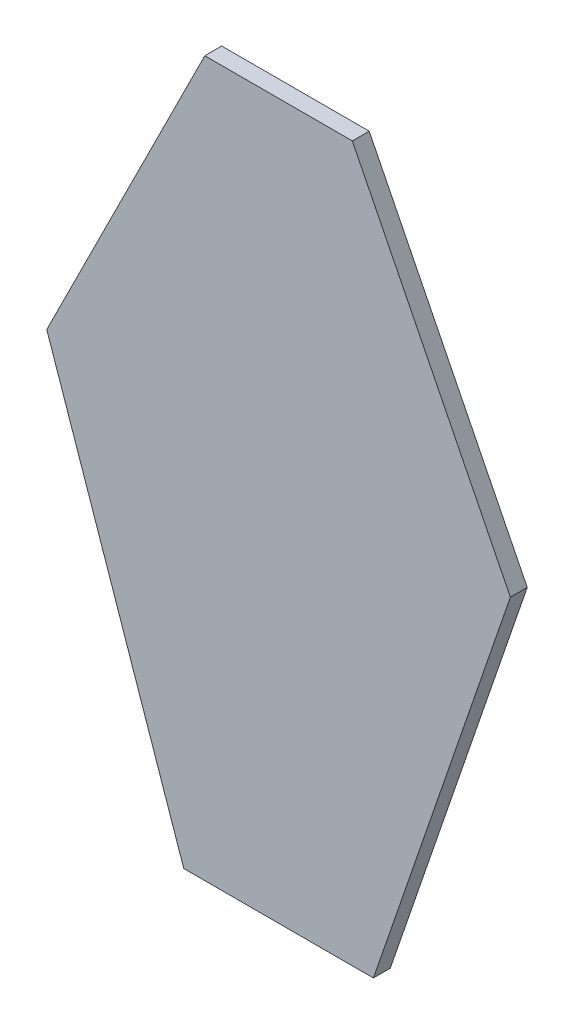
ISO-10303-21;
HEADER;
FILE_DESCRIPTION(('STEP AP214'),'2;1');
FILE_NAME('part.step','',(''),(''),'','','');
FILE_SCHEMA(('AUTOMOTIVE_DESIGN { 1 0 10303 214 1 1 1 1 }'));
ENDSEC;
DATA;
#1=APPLICATION_CONTEXT('core data for automotive mechanical design processes');
#2=APPLICATION_PROTOCOL_DEFINITION('international standard','automotive_design',2000,#1);
#3=PRODUCT_CONTEXT('',#1,'mechanical');
#4=PRODUCT('Part','Part','',(#3));
#5=PRODUCT_RELATED_PRODUCT_CATEGORY('part','',(#4));
#6=PRODUCT_DEFINITION_FORMATION('','',#4);
#7=PRODUCT_DEFINITION_CONTEXT('part definition',#1,'design');
#8=PRODUCT_DEFINITION('design','',#6,#7);
#9=PRODUCT_DEFINITION_SHAPE('','',#8);
#10=(LENGTH_UNIT() NAMED_UNIT(*) SI_UNIT(.MILLI.,.METRE.));
#11=(NAMED_UNIT(*) PLANE_ANGLE_UNIT() SI_UNIT($,.RADIAN.));
#12=(NAMED_UNIT(*) SI_UNIT($,.STERADIAN.) SOLID_ANGLE_UNIT());
#13=UNCERTAINTY_MEASURE_WITH_UNIT(LENGTH_MEASURE(1.E-05),#10,'distance_accuracy_value','');
#14=(GEOMETRIC_REPRESENTATION_CONTEXT(3) GLOBAL_UNCERTAINTY_ASSIGNED_CONTEXT((#13)) GLOBAL_UNIT_ASSIGNED_CONTEXT((#10,
#11,#12)) REPRESENTATION_CONTEXT('',''));
#15=CARTESIAN_POINT('',(0.,0.,0.));
#16=DIRECTION('',(0.,0.,1.));
#17=DIRECTION('',(1.,0.,0.));
#18=AXIS2_PLACEMENT_3D('',#15,#16,#17);
#19=CARTESIAN_POINT('',(-70.,228.,16.));
#20=DIRECTION('',(0.894427190999916,-0.447213595499958,0.));
#21=DIRECTION('',(0.447213595499958,0.894427190999916,0.));
#22=AXIS2_PLACEMENT_3D('',#19,#20,#21);
#23=PLANE('',#22);
#24=DIRECTION('',(-0.447213595499958,-0.894427190999916,0.));
#25=VECTOR('',#24,1.);
#26=CARTESIAN_POINT('',(-70.,228.,0.));
#27=LINE('',#26,#25);
#28=CARTESIAN_POINT('',(-70.,228.,0.));
#29=VERTEX_POINT('',#28);
#30=CARTESIAN_POINT('',(-220.,-71.9999999999998,0.));
#31=VERTEX_POINT('',#30);
#32=EDGE_CURVE('E114',#29,#31,#27,.T.);
#33=ORIENTED_EDGE('',*,*,#32,.T.);
#34=DIRECTION('',(0.,0.,-1.));
#35=VECTOR('',#34,1.);
#36=CARTESIAN_POINT('',(-220.,-71.9999999999998,16.));
#37=LINE('',#36,#35);
#38=CARTESIAN_POINT('',(-220.,-71.9999999999998,16.));
#39=VERTEX_POINT('',#38);
#40=EDGE_CURVE('E11',#39,#31,#37,.T.);
#41=ORIENTED_EDGE('',*,*,#40,.F.);
#42=DIRECTION('',(-0.447213595499958,-0.894427190999916,0.));
#43=VECTOR('',#42,1.);
#44=CARTESIAN_POINT('',(-70.,228.,16.));
#45=LINE('',#44,#43);
#46=CARTESIAN_POINT('',(-70.,228.,16.));
#47=VERTEX_POINT('',#46);
#48=EDGE_CURVE('E124',#47,#39,#45,.T.);
#49=ORIENTED_EDGE('',*,*,#48,.F.);
#50=DIRECTION('',(0.,0.,-1.));
#51=VECTOR('',#50,1.);
#52=CARTESIAN_POINT('',(-70.,228.,16.));
#53=LINE('',#52,#51);
#54=EDGE_CURVE('E110',#47,#29,#53,.T.);
#55=ORIENTED_EDGE('',*,*,#54,.T.);
#56=EDGE_LOOP('',(#33,#41,#49,#55));
#57=FACE_BOUND('',#56,.T.);
#58=ADVANCED_FACE('F30',(#57),#23,.F.);
#59=CARTESIAN_POINT('',(-220.,-71.9999999999998,16.));
#60=DIRECTION('',(0.945638521575876,0.325219597367365,0.));
#61=DIRECTION('',(-0.325219597367365,0.945638521575876,0.));
#62=AXIS2_PLACEMENT_3D('',#59,#60,#61);
#63=PLANE('',#62);
#64=DIRECTION('',(0.325219597367365,-0.945638521575876,0.));
#65=VECTOR('',#64,1.);
#66=CARTESIAN_POINT('',(-220.,-71.9999999999998,0.));
#67=LINE('',#66,#65);
#68=CARTESIAN_POINT('',(-89.9999999999999,-450.,0.));
#69=VERTEX_POINT('',#68);
#70=EDGE_CURVE('E117',#31,#69,#67,.T.);
#71=ORIENTED_EDGE('',*,*,#70,.T.);
#72=DIRECTION('',(0.,0.,-1.));
#73=VECTOR('',#72,1.);
#74=CARTESIAN_POINT('',(-89.9999999999999,-450.,16.));
#75=LINE('',#74,#73);
#76=CARTESIAN_POINT('',(-89.9999999999999,-450.,16.));
#77=VERTEX_POINT('',#76);
#78=EDGE_CURVE('E38',#77,#69,#75,.T.);
#79=ORIENTED_EDGE('',*,*,#78,.F.);
#80=DIRECTION('',(0.325219597367365,-0.945638521575876,0.));
#81=VECTOR('',#80,1.);
#82=CARTESIAN_POINT('',(-220.,-71.9999999999998,16.));
#83=LINE('',#82,#81);
#84=EDGE_CURVE('E83',#39,#77,#83,.T.);
#85=ORIENTED_EDGE('',*,*,#84,.F.);
#86=ORIENTED_EDGE('',*,*,#40,.T.);
#87=EDGE_LOOP('',(#71,#79,#85,#86));
#88=FACE_BOUND('',#87,.T.);
#89=ADVANCED_FACE('F148',(#88),#63,.F.);
#90=CARTESIAN_POINT('',(-89.9999999999999,-450.,16.));
#91=DIRECTION('',(0.,1.,0.));
#92=DIRECTION('',(0.,0.,1.));
#93=AXIS2_PLACEMENT_3D('',#90,#91,#92);
#94=PLANE('',#93);
#95=DIRECTION('',(1.,0.,0.));
#96=VECTOR('',#95,1.);
#97=CARTESIAN_POINT('',(-89.9999999999999,-450.,0.));
#98=LINE('',#97,#96);
#99=CARTESIAN_POINT('',(90.0000000000001,-450.,0.));
#100=VERTEX_POINT('',#99);
#101=EDGE_CURVE('E119',#69,#100,#98,.T.);
#102=ORIENTED_EDGE('',*,*,#101,.T.);
#103=DIRECTION('',(0.,0.,-1.));
#104=VECTOR('',#103,1.);
#105=CARTESIAN_POINT('',(90.0000000000001,-450.,16.));
#106=LINE('',#105,#104);
#107=CARTESIAN_POINT('',(90.0000000000001,-450.,16.));
#108=VERTEX_POINT('',#107);
#109=EDGE_CURVE('E105',#108,#100,#106,.T.);
#110=ORIENTED_EDGE('',*,*,#109,.F.);
#111=DIRECTION('',(1.,0.,0.));
#112=VECTOR('',#111,1.);
#113=CARTESIAN_POINT('',(-89.9999999999999,-450.,16.));
#114=LINE('',#113,#112);
#115=EDGE_CURVE('E96',#77,#108,#114,.T.);
#116=ORIENTED_EDGE('',*,*,#115,.F.);
#117=ORIENTED_EDGE('',*,*,#78,.T.);
#118=EDGE_LOOP('',(#102,#110,#116,#117));
#119=FACE_BOUND('',#118,.T.);
#120=ADVANCED_FACE('F130',(#119),#94,.F.);
#121=CARTESIAN_POINT('',(220.,-71.9999999999996,16.));
#122=DIRECTION('',(-0.945638521575876,0.325219597367365,0.));
#123=DIRECTION('',(-0.325219597367365,-0.945638521575877,0.));
#124=AXIS2_PLACEMENT_3D('',#121,#122,#123);
#125=PLANE('',#124);
#126=DIRECTION('',(0.325219597367365,0.945638521575876,0.));
#127=VECTOR('',#126,1.);
#128=CARTESIAN_POINT('',(220.,-71.9999999999996,0.));
#129=LINE('',#128,#127);
#130=CARTESIAN_POINT('',(220.,-71.9999999999996,0.));
#131=VERTEX_POINT('',#130);
#132=EDGE_CURVE('E104',#100,#131,#129,.T.);
#133=ORIENTED_EDGE('',*,*,#132,.T.);
#134=DIRECTION('',(0.,0.,-1.));
#135=VECTOR('',#134,1.);
#136=CARTESIAN_POINT('',(220.,-71.9999999999996,16.));
#137=LINE('',#136,#135);
#138=CARTESIAN_POINT('',(220.,-71.9999999999996,16.));
#139=VERTEX_POINT('',#138);
#140=EDGE_CURVE('E101',#139,#131,#137,.T.);
#141=ORIENTED_EDGE('',*,*,#140,.F.);
#142=DIRECTION('',(0.325219597367365,0.945638521575876,0.));
#143=VECTOR('',#142,1.);
#144=CARTESIAN_POINT('',(220.,-71.9999999999996,16.));
#145=LINE('',#144,#143);
#146=EDGE_CURVE('E90',#108,#139,#145,.T.);
#147=ORIENTED_EDGE('',*,*,#146,.F.);
#148=ORIENTED_EDGE('',*,*,#109,.T.);
#149=EDGE_LOOP('',(#133,#141,#147,#148));
#150=FACE_BOUND('',#149,.T.);
#151=ADVANCED_FACE('F102',(#150),#125,.F.);
#152=CARTESIAN_POINT('',(70.,228.,16.));
#153=DIRECTION('',(-0.894427190999916,-0.447213595499958,0.));
#154=DIRECTION('',(0.447213595499958,-0.894427190999916,0.));
#155=AXIS2_PLACEMENT_3D('',#152,#153,#154);
#156=PLANE('',#155);
#157=DIRECTION('',(-0.447213595499958,0.894427190999916,0.));
#158=VECTOR('',#157,1.);
#159=CARTESIAN_POINT('',(70.,228.,0.));
#160=LINE('',#159,#158);
#161=CARTESIAN_POINT('',(70.,228.,0.));
#162=VERTEX_POINT('',#161);
#163=EDGE_CURVE('E69',#131,#162,#160,.T.);
#164=ORIENTED_EDGE('',*,*,#163,.T.);
#165=DIRECTION('',(0.,0.,-1.));
#166=VECTOR('',#165,1.);
#167=CARTESIAN_POINT('',(70.,228.,16.));
#168=LINE('',#167,#166);
#169=CARTESIAN_POINT('',(70.,228.,16.));
#170=VERTEX_POINT('',#169);
#171=EDGE_CURVE('E106',#170,#162,#168,.T.);
#172=ORIENTED_EDGE('',*,*,#171,.F.);
#173=DIRECTION('',(-0.447213595499958,0.894427190999916,0.));
#174=VECTOR('',#173,1.);
#175=CARTESIAN_POINT('',(70.,228.,16.));
#176=LINE('',#175,#174);
#177=EDGE_CURVE('E94',#139,#170,#176,.T.);
#178=ORIENTED_EDGE('',*,*,#177,.F.);
#179=ORIENTED_EDGE('',*,*,#140,.T.);
#180=EDGE_LOOP('',(#164,#172,#178,#179));
#181=FACE_BOUND('',#180,.T.);
#182=ADVANCED_FACE('F108',(#181),#156,.F.);
#183=CARTESIAN_POINT('',(-70.,228.,16.));
#184=DIRECTION('',(0.,-1.,0.));
#185=DIRECTION('',(0.,0.,-1.));
#186=AXIS2_PLACEMENT_3D('',#183,#184,#185);
#187=PLANE('',#186);
#188=DIRECTION('',(-1.,0.,0.));
#189=VECTOR('',#188,1.);
#190=CARTESIAN_POINT('',(-70.,228.,0.));
#191=LINE('',#190,#189);
#192=EDGE_CURVE('E75',#162,#29,#191,.T.);
#193=ORIENTED_EDGE('',*,*,#192,.T.);
#194=ORIENTED_EDGE('',*,*,#54,.F.);
#195=DIRECTION('',(-1.,0.,0.));
#196=VECTOR('',#195,1.);
#197=CARTESIAN_POINT('',(-70.,228.,16.));
#198=LINE('',#197,#196);
#199=EDGE_CURVE('E46',#170,#47,#198,.T.);
#200=ORIENTED_EDGE('',*,*,#199,.F.);
#201=ORIENTED_EDGE('',*,*,#171,.T.);
#202=EDGE_LOOP('',(#193,#194,#200,#201));
#203=FACE_BOUND('',#202,.T.);
#204=ADVANCED_FACE('F137',(#203),#187,.F.);
#205=CARTESIAN_POINT('',(-409.,-450.,16.));
#206=DIRECTION('',(0.,0.,1.));
#207=DIRECTION('',(1.,0.,0.));
#208=AXIS2_PLACEMENT_3D('',#205,#206,#207);
#209=PLANE('',#208);
#210=ORIENTED_EDGE('',*,*,#48,.T.);
#211=ORIENTED_EDGE('',*,*,#84,.T.);
#212=ORIENTED_EDGE('',*,*,#115,.T.);
#213=ORIENTED_EDGE('',*,*,#146,.T.);
#214=ORIENTED_EDGE('',*,*,#177,.T.);
#215=ORIENTED_EDGE('',*,*,#199,.T.);
#216=EDGE_LOOP('',(#210,#211,#212,#213,#214,#215));
#217=FACE_BOUND('',#216,.T.);
#218=ADVANCED_FACE('F92',(#217),#209,.T.);
#219=CARTESIAN_POINT('',(-409.,-450.,0.));
#220=DIRECTION('',(0.,0.,1.));
#221=DIRECTION('',(1.,0.,0.));
#222=AXIS2_PLACEMENT_3D('',#219,#220,#221);
#223=PLANE('',#222);
#224=ORIENTED_EDGE('',*,*,#32,.F.);
#225=ORIENTED_EDGE('',*,*,#192,.F.);
#226=ORIENTED_EDGE('',*,*,#163,.F.);
#227=ORIENTED_EDGE('',*,*,#132,.F.);
#228=ORIENTED_EDGE('',*,*,#101,.F.);
#229=ORIENTED_EDGE('',*,*,#70,.F.);
#230=EDGE_LOOP('',(#224,#225,#226,#227,#228,#229));
#231=FACE_BOUND('',#230,.T.);
#232=ADVANCED_FACE('F133',(#231),#223,.F.);
#233=CLOSED_SHELL('',(#58,#89,#120,#151,#182,#204,#218,#232));
#234=MANIFOLD_SOLID_BREP('B2',#233);
#235=ADVANCED_BREP_SHAPE_REPRESENTATION('',(#18,#234),#14);
#236=SHAPE_DEFINITION_REPRESENTATION(#9,#235);
ENDSEC;
END-ISO-10303-21;
